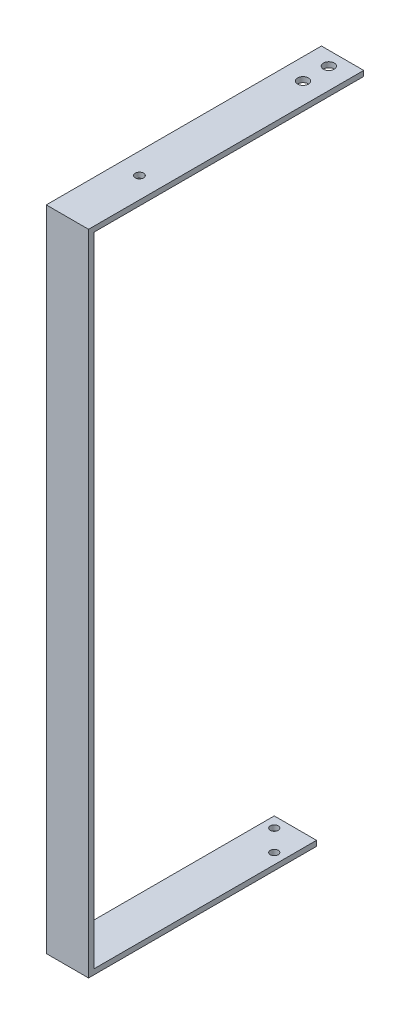
ISO-10303-21;
HEADER;
FILE_DESCRIPTION(('STEP AP214'),'2;1');
FILE_NAME('part.step','',(''),(''),'','','');
FILE_SCHEMA(('AUTOMOTIVE_DESIGN { 1 0 10303 214 1 1 1 1 }'));
ENDSEC;
DATA;
#1=APPLICATION_CONTEXT('core data for automotive mechanical design processes');
#2=APPLICATION_PROTOCOL_DEFINITION('international standard','automotive_design',2000,#1);
#3=PRODUCT_CONTEXT('',#1,'mechanical');
#4=PRODUCT('Part','Part','',(#3));
#5=PRODUCT_RELATED_PRODUCT_CATEGORY('part','',(#4));
#6=PRODUCT_DEFINITION_FORMATION('','',#4);
#7=PRODUCT_DEFINITION_CONTEXT('part definition',#1,'design');
#8=PRODUCT_DEFINITION('design','',#6,#7);
#9=PRODUCT_DEFINITION_SHAPE('','',#8);
#10=(LENGTH_UNIT() NAMED_UNIT(*) SI_UNIT(.MILLI.,.METRE.));
#11=(NAMED_UNIT(*) PLANE_ANGLE_UNIT() SI_UNIT($,.RADIAN.));
#12=(NAMED_UNIT(*) SI_UNIT($,.STERADIAN.) SOLID_ANGLE_UNIT());
#13=UNCERTAINTY_MEASURE_WITH_UNIT(LENGTH_MEASURE(1.E-05),#10,'distance_accuracy_value','');
#14=(GEOMETRIC_REPRESENTATION_CONTEXT(3) GLOBAL_UNCERTAINTY_ASSIGNED_CONTEXT((#13)) GLOBAL_UNIT_ASSIGNED_CONTEXT((#10,
#11,#12)) REPRESENTATION_CONTEXT('',''));
#15=CARTESIAN_POINT('',(0.,0.,0.));
#16=DIRECTION('',(0.,0.,1.));
#17=DIRECTION('',(1.,0.,0.));
#18=AXIS2_PLACEMENT_3D('',#15,#16,#17);
#19=CARTESIAN_POINT('',(25.3999999999999,776.105,267.68));
#20=DIRECTION('',(0.,0.,1.));
#21=DIRECTION('',(1.,0.,0.));
#22=AXIS2_PLACEMENT_3D('',#19,#20,#21);
#23=PLANE('',#22);
#24=DIRECTION('',(-1.,0.,0.));
#25=VECTOR('',#24,1.);
#26=CARTESIAN_POINT('',(-25.4000000000001,769.795,267.68));
#27=LINE('',#26,#25);
#28=CARTESIAN_POINT('',(25.3999999999999,769.795,267.68));
#29=VERTEX_POINT('',#28);
#30=CARTESIAN_POINT('',(-25.4000000000001,769.795,267.68));
#31=VERTEX_POINT('',#30);
#32=EDGE_CURVE('E145',#29,#31,#27,.T.);
#33=ORIENTED_EDGE('',*,*,#32,.F.);
#34=DIRECTION('',(0.,-1.,0.));
#35=VECTOR('',#34,1.);
#36=CARTESIAN_POINT('',(25.3999999999999,776.105,267.68));
#37=LINE('',#36,#35);
#38=CARTESIAN_POINT('',(25.4,3.155,267.68));
#39=VERTEX_POINT('',#38);
#40=EDGE_CURVE('E51',#29,#39,#37,.T.);
#41=ORIENTED_EDGE('',*,*,#40,.T.);
#42=DIRECTION('',(-1.,0.,0.));
#43=VECTOR('',#42,1.);
#44=CARTESIAN_POINT('',(25.4,3.155,267.68));
#45=LINE('',#44,#43);
#46=CARTESIAN_POINT('',(-25.4,3.155,267.68));
#47=VERTEX_POINT('',#46);
#48=EDGE_CURVE('E165',#39,#47,#45,.T.);
#49=ORIENTED_EDGE('',*,*,#48,.T.);
#50=DIRECTION('',(0.,-1.,0.));
#51=VECTOR('',#50,1.);
#52=CARTESIAN_POINT('',(-25.4000000000001,776.105,267.68));
#53=LINE('',#52,#51);
#54=EDGE_CURVE('E88',#31,#47,#53,.T.);
#55=ORIENTED_EDGE('',*,*,#54,.F.);
#56=EDGE_LOOP('',(#33,#41,#49,#55));
#57=FACE_BOUND('',#56,.T.);
#58=ADVANCED_FACE('F34',(#57),#23,.F.);
#59=CARTESIAN_POINT('',(25.4,3.155,273.99));
#60=DIRECTION('',(0.,-1.,0.));
#61=DIRECTION('',(1.,0.,0.));
#62=AXIS2_PLACEMENT_3D('',#59,#60,#61);
#63=PLANE('',#62);
#64=CARTESIAN_POINT('',(12.7,3.155,38.1));
#65=DIRECTION('',(0.,-1.,0.));
#66=DIRECTION('',(1.,0.,0.));
#67=AXIS2_PLACEMENT_3D('',#64,#65,#66);
#68=CIRCLE('',#67,4.7625);
#69=CARTESIAN_POINT('',(17.4625,3.155,38.1));
#70=VERTEX_POINT('',#69);
#71=EDGE_CURVE('E136',#70,#70,#68,.T.);
#72=ORIENTED_EDGE('',*,*,#71,.T.);
#73=EDGE_LOOP('',(#72));
#74=FACE_BOUND('',#73,.T.);
#75=CARTESIAN_POINT('',(-12.7,3.155,12.7));
#76=DIRECTION('',(0.,-1.,0.));
#77=DIRECTION('',(1.,0.,0.));
#78=AXIS2_PLACEMENT_3D('',#75,#76,#77);
#79=CIRCLE('',#78,4.7625);
#80=CARTESIAN_POINT('',(-7.93749999999999,3.155,12.7));
#81=VERTEX_POINT('',#80);
#82=EDGE_CURVE('E142',#81,#81,#79,.T.);
#83=ORIENTED_EDGE('',*,*,#82,.T.);
#84=EDGE_LOOP('',(#83));
#85=FACE_BOUND('',#84,.T.);
#86=ORIENTED_EDGE('',*,*,#48,.F.);
#87=DIRECTION('',(0.,0.,-1.));
#88=VECTOR('',#87,1.);
#89=CARTESIAN_POINT('',(25.4,3.155,273.99));
#90=LINE('',#89,#88);
#91=CARTESIAN_POINT('',(25.4,3.155,0.));
#92=VERTEX_POINT('',#91);
#93=EDGE_CURVE('E90',#39,#92,#90,.T.);
#94=ORIENTED_EDGE('',*,*,#93,.T.);
#95=DIRECTION('',(-1.,0.,0.));
#96=VECTOR('',#95,1.);
#97=CARTESIAN_POINT('',(25.4,3.155,0.));
#98=LINE('',#97,#96);
#99=CARTESIAN_POINT('',(-25.4,3.155,0.));
#100=VERTEX_POINT('',#99);
#101=EDGE_CURVE('E94',#92,#100,#98,.T.);
#102=ORIENTED_EDGE('',*,*,#101,.T.);
#103=DIRECTION('',(0.,0.,-1.));
#104=VECTOR('',#103,1.);
#105=CARTESIAN_POINT('',(-25.4,3.155,273.99));
#106=LINE('',#105,#104);
#107=EDGE_CURVE('E80',#47,#100,#106,.T.);
#108=ORIENTED_EDGE('',*,*,#107,.F.);
#109=EDGE_LOOP('',(#86,#94,#102,#108));
#110=FACE_BOUND('',#109,.T.);
#111=ADVANCED_FACE('F95',(#74,#85,#110),#63,.F.);
#112=CARTESIAN_POINT('',(-25.4,-3.155,273.99));
#113=DIRECTION('',(1.,0.,0.));
#114=DIRECTION('',(0.,0.,-1.));
#115=AXIS2_PLACEMENT_3D('',#112,#113,#114);
#116=PLANE('',#115);
#117=DIRECTION('',(0.,-1.,0.));
#118=VECTOR('',#117,1.);
#119=CARTESIAN_POINT('',(-25.4,-3.155,0.));
#120=LINE('',#119,#118);
#121=CARTESIAN_POINT('',(-25.4,-3.155,0.));
#122=VERTEX_POINT('',#121);
#123=EDGE_CURVE('E84',#100,#122,#120,.T.);
#124=ORIENTED_EDGE('',*,*,#123,.T.);
#125=DIRECTION('',(0.,0.,-1.));
#126=VECTOR('',#125,1.);
#127=CARTESIAN_POINT('',(-25.4,-3.155,273.99));
#128=LINE('',#127,#126);
#129=CARTESIAN_POINT('',(-25.4,-3.155,273.99));
#130=VERTEX_POINT('',#129);
#131=EDGE_CURVE('E11',#130,#122,#128,.T.);
#132=ORIENTED_EDGE('',*,*,#131,.F.);
#133=DIRECTION('',(0.,-1.,0.));
#134=VECTOR('',#133,1.);
#135=CARTESIAN_POINT('',(-25.4,-3.155,273.99));
#136=LINE('',#135,#134);
#137=CARTESIAN_POINT('',(-25.4000000000001,776.105,273.99));
#138=VERTEX_POINT('',#137);
#139=EDGE_CURVE('E100',#138,#130,#136,.T.);
#140=ORIENTED_EDGE('',*,*,#139,.F.);
#141=DIRECTION('',(0.,0.,1.));
#142=VECTOR('',#141,1.);
#143=CARTESIAN_POINT('',(-25.4000000000001,776.105,267.68));
#144=LINE('',#143,#142);
#145=CARTESIAN_POINT('',(-25.4000000000001,776.105,-56.71));
#146=VERTEX_POINT('',#145);
#147=EDGE_CURVE('E166',#146,#138,#144,.T.);
#148=ORIENTED_EDGE('',*,*,#147,.F.);
#149=DIRECTION('',(0.,1.,0.));
#150=VECTOR('',#149,1.);
#151=CARTESIAN_POINT('',(-25.4000000000001,776.105,-56.71));
#152=LINE('',#151,#150);
#153=CARTESIAN_POINT('',(-25.4000000000001,769.795,-56.71));
#154=VERTEX_POINT('',#153);
#155=EDGE_CURVE('E155',#154,#146,#152,.T.);
#156=ORIENTED_EDGE('',*,*,#155,.F.);
#157=DIRECTION('',(0.,0.,1.));
#158=VECTOR('',#157,1.);
#159=CARTESIAN_POINT('',(-25.4000000000001,769.795,-56.71));
#160=LINE('',#159,#158);
#161=EDGE_CURVE('E158',#154,#31,#160,.T.);
#162=ORIENTED_EDGE('',*,*,#161,.T.);
#163=ORIENTED_EDGE('',*,*,#54,.T.);
#164=ORIENTED_EDGE('',*,*,#107,.T.);
#165=EDGE_LOOP('',(#124,#132,#140,#148,#156,#162,#163,#164));
#166=FACE_BOUND('',#165,.T.);
#167=ADVANCED_FACE('F36',(#166),#116,.F.);
#168=CARTESIAN_POINT('',(25.4,-3.155,273.99));
#169=DIRECTION('',(0.,1.,0.));
#170=DIRECTION('',(-1.,0.,0.));
#171=AXIS2_PLACEMENT_3D('',#168,#169,#170);
#172=PLANE('',#171);
#173=CARTESIAN_POINT('',(12.7,-3.155,38.1));
#174=DIRECTION('',(0.,-1.,0.));
#175=DIRECTION('',(1.,0.,0.));
#176=AXIS2_PLACEMENT_3D('',#173,#174,#175);
#177=CIRCLE('',#176,4.7625);
#178=CARTESIAN_POINT('',(17.4625,-3.155,38.1));
#179=VERTEX_POINT('',#178);
#180=EDGE_CURVE('E117',#179,#179,#177,.T.);
#181=ORIENTED_EDGE('',*,*,#180,.F.);
#182=EDGE_LOOP('',(#181));
#183=FACE_BOUND('',#182,.T.);
#184=CARTESIAN_POINT('',(-12.7,-3.155,12.7));
#185=DIRECTION('',(0.,-1.,0.));
#186=DIRECTION('',(1.,0.,0.));
#187=AXIS2_PLACEMENT_3D('',#184,#185,#186);
#188=CIRCLE('',#187,4.7625);
#189=CARTESIAN_POINT('',(-7.93749999999999,-3.155,12.7));
#190=VERTEX_POINT('',#189);
#191=EDGE_CURVE('E139',#190,#190,#188,.T.);
#192=ORIENTED_EDGE('',*,*,#191,.F.);
#193=EDGE_LOOP('',(#192));
#194=FACE_BOUND('',#193,.T.);
#195=DIRECTION('',(1.,0.,0.));
#196=VECTOR('',#195,1.);
#197=CARTESIAN_POINT('',(25.4,-3.155,0.));
#198=LINE('',#197,#196);
#199=CARTESIAN_POINT('',(25.4,-3.155,0.));
#200=VERTEX_POINT('',#199);
#201=EDGE_CURVE('E104',#122,#200,#198,.T.);
#202=ORIENTED_EDGE('',*,*,#201,.T.);
#203=DIRECTION('',(0.,0.,-1.));
#204=VECTOR('',#203,1.);
#205=CARTESIAN_POINT('',(25.4,-3.155,273.99));
#206=LINE('',#205,#204);
#207=CARTESIAN_POINT('',(25.4,-3.155,273.99));
#208=VERTEX_POINT('',#207);
#209=EDGE_CURVE('E43',#208,#200,#206,.T.);
#210=ORIENTED_EDGE('',*,*,#209,.F.);
#211=DIRECTION('',(1.,0.,0.));
#212=VECTOR('',#211,1.);
#213=CARTESIAN_POINT('',(25.4,-3.155,273.99));
#214=LINE('',#213,#212);
#215=EDGE_CURVE('E60',#130,#208,#214,.T.);
#216=ORIENTED_EDGE('',*,*,#215,.F.);
#217=ORIENTED_EDGE('',*,*,#131,.T.);
#218=EDGE_LOOP('',(#202,#210,#216,#217));
#219=FACE_BOUND('',#218,.T.);
#220=ADVANCED_FACE('F210',(#183,#194,#219),#172,.F.);
#221=CARTESIAN_POINT('',(25.4,-3.155,273.99));
#222=DIRECTION('',(-1.,0.,0.));
#223=DIRECTION('',(0.,0.,1.));
#224=AXIS2_PLACEMENT_3D('',#221,#222,#223);
#225=PLANE('',#224);
#226=DIRECTION('',(0.,1.,0.));
#227=VECTOR('',#226,1.);
#228=CARTESIAN_POINT('',(25.4,-3.155,0.));
#229=LINE('',#228,#227);
#230=EDGE_CURVE('E101',#200,#92,#229,.T.);
#231=ORIENTED_EDGE('',*,*,#230,.T.);
#232=ORIENTED_EDGE('',*,*,#93,.F.);
#233=ORIENTED_EDGE('',*,*,#40,.F.);
#234=DIRECTION('',(0.,0.,1.));
#235=VECTOR('',#234,1.);
#236=CARTESIAN_POINT('',(25.3999999999999,769.795,-56.71));
#237=LINE('',#236,#235);
#238=CARTESIAN_POINT('',(25.3999999999999,769.795,-56.71));
#239=VERTEX_POINT('',#238);
#240=EDGE_CURVE('E162',#239,#29,#237,.T.);
#241=ORIENTED_EDGE('',*,*,#240,.F.);
#242=DIRECTION('',(0.,-1.,0.));
#243=VECTOR('',#242,1.);
#244=CARTESIAN_POINT('',(25.3999999999999,769.795,-56.71));
#245=LINE('',#244,#243);
#246=CARTESIAN_POINT('',(25.3999999999999,776.105,-56.71));
#247=VERTEX_POINT('',#246);
#248=EDGE_CURVE('E149',#247,#239,#245,.T.);
#249=ORIENTED_EDGE('',*,*,#248,.F.);
#250=DIRECTION('',(0.,0.,-1.));
#251=VECTOR('',#250,1.);
#252=CARTESIAN_POINT('',(25.3999999999999,776.105,273.99));
#253=LINE('',#252,#251);
#254=CARTESIAN_POINT('',(25.3999999999999,776.105,273.99));
#255=VERTEX_POINT('',#254);
#256=EDGE_CURVE('E172',#255,#247,#253,.T.);
#257=ORIENTED_EDGE('',*,*,#256,.F.);
#258=DIRECTION('',(0.,1.,0.));
#259=VECTOR('',#258,1.);
#260=CARTESIAN_POINT('',(25.4,-3.155,273.99));
#261=LINE('',#260,#259);
#262=EDGE_CURVE('E91',#208,#255,#261,.T.);
#263=ORIENTED_EDGE('',*,*,#262,.F.);
#264=ORIENTED_EDGE('',*,*,#209,.T.);
#265=EDGE_LOOP('',(#231,#232,#233,#241,#249,#257,#263,#264));
#266=FACE_BOUND('',#265,.T.);
#267=ADVANCED_FACE('F190',(#266),#225,.F.);
#268=CARTESIAN_POINT('',(0.,0.,273.99));
#269=DIRECTION('',(0.,0.,1.));
#270=DIRECTION('',(1.,0.,0.));
#271=AXIS2_PLACEMENT_3D('',#268,#269,#270);
#272=PLANE('',#271);
#273=ORIENTED_EDGE('',*,*,#139,.T.);
#274=ORIENTED_EDGE('',*,*,#215,.T.);
#275=ORIENTED_EDGE('',*,*,#262,.T.);
#276=DIRECTION('',(1.,0.,0.));
#277=VECTOR('',#276,1.);
#278=CARTESIAN_POINT('',(-25.4000000000001,776.105,273.99));
#279=LINE('',#278,#277);
#280=EDGE_CURVE('E169',#138,#255,#279,.T.);
#281=ORIENTED_EDGE('',*,*,#280,.F.);
#282=EDGE_LOOP('',(#273,#274,#275,#281));
#283=FACE_BOUND('',#282,.T.);
#284=ADVANCED_FACE('F179',(#283),#272,.T.);
#285=CARTESIAN_POINT('',(0.,0.,0.));
#286=DIRECTION('',(0.,0.,1.));
#287=DIRECTION('',(1.,0.,0.));
#288=AXIS2_PLACEMENT_3D('',#285,#286,#287);
#289=PLANE('',#288);
#290=ORIENTED_EDGE('',*,*,#123,.F.);
#291=ORIENTED_EDGE('',*,*,#101,.F.);
#292=ORIENTED_EDGE('',*,*,#230,.F.);
#293=ORIENTED_EDGE('',*,*,#201,.F.);
#294=EDGE_LOOP('',(#290,#291,#292,#293));
#295=FACE_BOUND('',#294,.T.);
#296=ADVANCED_FACE('F103',(#295),#289,.F.);
#297=CARTESIAN_POINT('',(-1.0601004435614E-13,776.105,0.));
#298=DIRECTION('',(0.,1.,0.));
#299=DIRECTION('',(-1.,0.,0.));
#300=AXIS2_PLACEMENT_3D('',#297,#298,#299);
#301=PLANE('',#300);
#302=CARTESIAN_POINT('',(-1.0601004435614E-13,776.105,187.48));
#303=DIRECTION('',(0.,1.,0.));
#304=DIRECTION('',(-1.,0.,0.));
#305=AXIS2_PLACEMENT_3D('',#302,#303,#304);
#306=CIRCLE('',#305,5.);
#307=CARTESIAN_POINT('',(-5.00000000000011,776.105,187.48));
#308=VERTEX_POINT('',#307);
#309=EDGE_CURVE('E131',#308,#308,#306,.T.);
#310=ORIENTED_EDGE('',*,*,#309,.F.);
#311=EDGE_LOOP('',(#310));
#312=FACE_BOUND('',#311,.T.);
#313=CARTESIAN_POINT('',(-1.02213639278783E-13,776.105,-9.20999999999998));
#314=DIRECTION('',(0.,1.,0.));
#315=DIRECTION('',(-1.,0.,0.));
#316=AXIS2_PLACEMENT_3D('',#313,#314,#315);
#317=CIRCLE('',#316,6.5);
#318=CARTESIAN_POINT('',(-6.5000000000001,776.105,-9.20999999999998));
#319=VERTEX_POINT('',#318);
#320=EDGE_CURVE('E121',#319,#319,#317,.T.);
#321=ORIENTED_EDGE('',*,*,#320,.F.);
#322=EDGE_LOOP('',(#321));
#323=FACE_BOUND('',#322,.T.);
#324=CARTESIAN_POINT('',(-1.03989377137547E-13,776.105,-40.21));
#325=DIRECTION('',(0.,1.,0.));
#326=DIRECTION('',(-1.,0.,0.));
#327=AXIS2_PLACEMENT_3D('',#324,#325,#326);
#328=CIRCLE('',#327,6.5);
#329=CARTESIAN_POINT('',(-6.5000000000001,776.105,-40.21));
#330=VERTEX_POINT('',#329);
#331=EDGE_CURVE('E118',#330,#330,#328,.T.);
#332=ORIENTED_EDGE('',*,*,#331,.F.);
#333=EDGE_LOOP('',(#332));
#334=FACE_BOUND('',#333,.T.);
#335=ORIENTED_EDGE('',*,*,#147,.T.);
#336=ORIENTED_EDGE('',*,*,#280,.T.);
#337=ORIENTED_EDGE('',*,*,#256,.T.);
#338=DIRECTION('',(1.,0.,0.));
#339=VECTOR('',#338,1.);
#340=CARTESIAN_POINT('',(25.3999999999999,776.105,-56.71));
#341=LINE('',#340,#339);
#342=EDGE_CURVE('E146',#146,#247,#341,.T.);
#343=ORIENTED_EDGE('',*,*,#342,.F.);
#344=EDGE_LOOP('',(#335,#336,#337,#343));
#345=FACE_BOUND('',#344,.T.);
#346=ADVANCED_FACE('F185',(#312,#323,#334,#345),#301,.T.);
#347=CARTESIAN_POINT('',(-25.4000000000001,769.795,-56.71));
#348=DIRECTION('',(0.,1.,0.));
#349=DIRECTION('',(0.,0.,1.));
#350=AXIS2_PLACEMENT_3D('',#347,#348,#349);
#351=PLANE('',#350);
#352=CARTESIAN_POINT('',(-1.05148146314139E-13,769.795,187.48));
#353=DIRECTION('',(0.,1.,0.));
#354=DIRECTION('',(0.,0.,1.));
#355=AXIS2_PLACEMENT_3D('',#352,#353,#354);
#356=CIRCLE('',#355,5.);
#357=CARTESIAN_POINT('',(-1.05148146314139E-13,769.795,192.48));
#358=VERTEX_POINT('',#357);
#359=EDGE_CURVE('E38',#358,#358,#356,.T.);
#360=ORIENTED_EDGE('',*,*,#359,.T.);
#361=EDGE_LOOP('',(#360));
#362=FACE_BOUND('',#361,.T.);
#363=CARTESIAN_POINT('',(-1.01351741236782E-13,769.795,-9.20999999999998));
#364=DIRECTION('',(0.,1.,0.));
#365=DIRECTION('',(0.,0.,1.));
#366=AXIS2_PLACEMENT_3D('',#363,#364,#365);
#367=CIRCLE('',#366,6.5);
#368=CARTESIAN_POINT('',(-1.01351741236782E-13,769.795,-2.70999999999998));
#369=VERTEX_POINT('',#368);
#370=EDGE_CURVE('E119',#369,#369,#367,.T.);
#371=ORIENTED_EDGE('',*,*,#370,.T.);
#372=EDGE_LOOP('',(#371));
#373=FACE_BOUND('',#372,.T.);
#374=CARTESIAN_POINT('',(-1.03127479095546E-13,769.795,-40.21));
#375=DIRECTION('',(0.,1.,0.));
#376=DIRECTION('',(0.,0.,1.));
#377=AXIS2_PLACEMENT_3D('',#374,#375,#376);
#378=CIRCLE('',#377,6.5);
#379=CARTESIAN_POINT('',(-1.03127479095546E-13,769.795,-33.71));
#380=VERTEX_POINT('',#379);
#381=EDGE_CURVE('E115',#380,#380,#378,.T.);
#382=ORIENTED_EDGE('',*,*,#381,.T.);
#383=EDGE_LOOP('',(#382));
#384=FACE_BOUND('',#383,.T.);
#385=ORIENTED_EDGE('',*,*,#32,.T.);
#386=ORIENTED_EDGE('',*,*,#161,.F.);
#387=DIRECTION('',(-1.,0.,0.));
#388=VECTOR('',#387,1.);
#389=CARTESIAN_POINT('',(-25.4000000000001,769.795,-56.71));
#390=LINE('',#389,#388);
#391=EDGE_CURVE('E152',#239,#154,#390,.T.);
#392=ORIENTED_EDGE('',*,*,#391,.F.);
#393=ORIENTED_EDGE('',*,*,#240,.T.);
#394=EDGE_LOOP('',(#385,#386,#392,#393));
#395=FACE_BOUND('',#394,.T.);
#396=ADVANCED_FACE('F236',(#362,#373,#384,#395),#351,.F.);
#397=CARTESIAN_POINT('',(0.,0.,-56.71));
#398=DIRECTION('',(0.,0.,1.));
#399=DIRECTION('',(1.,0.,0.));
#400=AXIS2_PLACEMENT_3D('',#397,#398,#399);
#401=PLANE('',#400);
#402=ORIENTED_EDGE('',*,*,#342,.T.);
#403=ORIENTED_EDGE('',*,*,#248,.T.);
#404=ORIENTED_EDGE('',*,*,#391,.T.);
#405=ORIENTED_EDGE('',*,*,#155,.T.);
#406=EDGE_LOOP('',(#402,#403,#404,#405));
#407=FACE_BOUND('',#406,.T.);
#408=ADVANCED_FACE('F197',(#407),#401,.F.);
#409=CARTESIAN_POINT('',(-12.7,6.845,12.7));
#410=DIRECTION('',(0.,-1.,0.));
#411=DIRECTION('',(1.,0.,0.));
#412=AXIS2_PLACEMENT_3D('',#409,#410,#411);
#413=CYLINDRICAL_SURFACE('',#412,4.7625);
#414=ORIENTED_EDGE('',*,*,#191,.T.);
#415=EDGE_LOOP('',(#414));
#416=FACE_BOUND('',#415,.T.);
#417=ORIENTED_EDGE('',*,*,#82,.F.);
#418=EDGE_LOOP('',(#417));
#419=FACE_BOUND('',#418,.T.);
#420=ADVANCED_FACE('F264',(#416,#419),#413,.F.);
#421=CARTESIAN_POINT('',(12.7,6.845,38.1));
#422=DIRECTION('',(0.,-1.,0.));
#423=DIRECTION('',(1.,0.,0.));
#424=AXIS2_PLACEMENT_3D('',#421,#422,#423);
#425=CYLINDRICAL_SURFACE('',#424,4.7625);
#426=ORIENTED_EDGE('',*,*,#180,.T.);
#427=EDGE_LOOP('',(#426));
#428=FACE_BOUND('',#427,.T.);
#429=ORIENTED_EDGE('',*,*,#71,.F.);
#430=EDGE_LOOP('',(#429));
#431=FACE_BOUND('',#430,.T.);
#432=ADVANCED_FACE('F252',(#428,#431),#425,.F.);
#433=CARTESIAN_POINT('',(-1.02623453140715E-13,766.105,-40.21));
#434=DIRECTION('',(0.,1.,0.));
#435=DIRECTION('',(-1.,0.,0.));
#436=AXIS2_PLACEMENT_3D('',#433,#434,#435);
#437=CYLINDRICAL_SURFACE('',#436,6.5);
#438=ORIENTED_EDGE('',*,*,#331,.T.);
#439=EDGE_LOOP('',(#438));
#440=FACE_BOUND('',#439,.T.);
#441=ORIENTED_EDGE('',*,*,#381,.F.);
#442=EDGE_LOOP('',(#441));
#443=FACE_BOUND('',#442,.T.);
#444=ADVANCED_FACE('F248',(#440,#443),#437,.F.);
#445=CARTESIAN_POINT('',(-1.00847715281951E-13,766.105,-9.20999999999998));
#446=DIRECTION('',(0.,1.,0.));
#447=DIRECTION('',(-1.,0.,0.));
#448=AXIS2_PLACEMENT_3D('',#445,#446,#447);
#449=CYLINDRICAL_SURFACE('',#448,6.5);
#450=ORIENTED_EDGE('',*,*,#320,.T.);
#451=EDGE_LOOP('',(#450));
#452=FACE_BOUND('',#451,.T.);
#453=ORIENTED_EDGE('',*,*,#370,.F.);
#454=EDGE_LOOP('',(#453));
#455=FACE_BOUND('',#454,.T.);
#456=ADVANCED_FACE('F251',(#452,#455),#449,.F.);
#457=CARTESIAN_POINT('',(-1.01229310367228E-13,741.105,187.48));
#458=DIRECTION('',(0.,1.,0.));
#459=DIRECTION('',(-1.,0.,0.));
#460=AXIS2_PLACEMENT_3D('',#457,#458,#459);
#461=CYLINDRICAL_SURFACE('',#460,5.);
#462=ORIENTED_EDGE('',*,*,#309,.T.);
#463=EDGE_LOOP('',(#462));
#464=FACE_BOUND('',#463,.T.);
#465=ORIENTED_EDGE('',*,*,#359,.F.);
#466=EDGE_LOOP('',(#465));
#467=FACE_BOUND('',#466,.T.);
#468=ADVANCED_FACE('F262',(#464,#467),#461,.F.);
#469=CLOSED_SHELL('',(#58,#111,#167,#220,#267,#284,#296,#346,#396,#408,#420,#432,#444,#456,#468));
#470=MANIFOLD_SOLID_BREP('B2',#469);
#471=ADVANCED_BREP_SHAPE_REPRESENTATION('',(#18,#470),#14);
#472=SHAPE_DEFINITION_REPRESENTATION(#9,#471);
ENDSEC;
END-ISO-10303-21;
